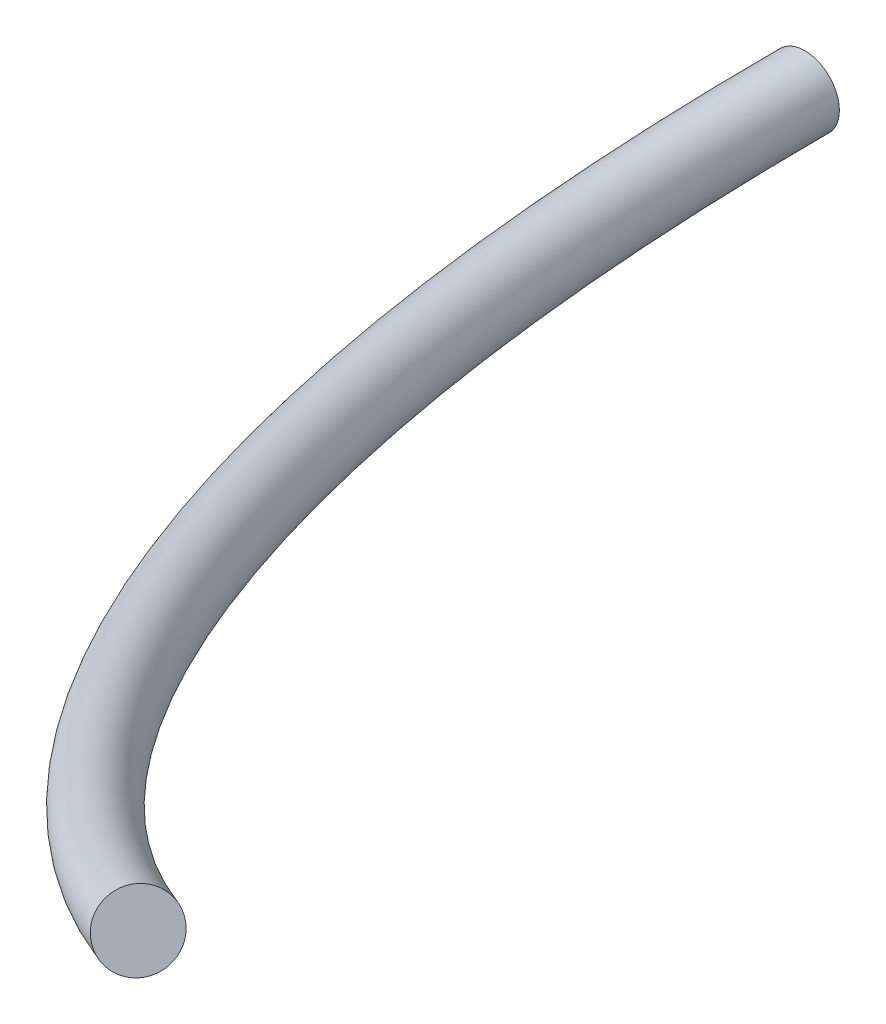
ISO-10303-21;
HEADER;
FILE_DESCRIPTION(('STEP AP214'),'2;1');
FILE_NAME('part.step','',(''),(''),'','','');
FILE_SCHEMA(('AUTOMOTIVE_DESIGN { 1 0 10303 214 1 1 1 1 }'));
ENDSEC;
DATA;
#1=APPLICATION_CONTEXT('core data for automotive mechanical design processes');
#2=APPLICATION_PROTOCOL_DEFINITION('international standard','automotive_design',2000,#1);
#3=PRODUCT_CONTEXT('',#1,'mechanical');
#4=PRODUCT('Part','Part','',(#3));
#5=PRODUCT_RELATED_PRODUCT_CATEGORY('part','',(#4));
#6=PRODUCT_DEFINITION_FORMATION('','',#4);
#7=PRODUCT_DEFINITION_CONTEXT('part definition',#1,'design');
#8=PRODUCT_DEFINITION('design','',#6,#7);
#9=PRODUCT_DEFINITION_SHAPE('','',#8);
#10=(LENGTH_UNIT() NAMED_UNIT(*) SI_UNIT(.MILLI.,.METRE.));
#11=(NAMED_UNIT(*) PLANE_ANGLE_UNIT() SI_UNIT($,.RADIAN.));
#12=(NAMED_UNIT(*) SI_UNIT($,.STERADIAN.) SOLID_ANGLE_UNIT());
#13=UNCERTAINTY_MEASURE_WITH_UNIT(LENGTH_MEASURE(1.E-05),#10,'distance_accuracy_value','');
#14=(GEOMETRIC_REPRESENTATION_CONTEXT(3) GLOBAL_UNCERTAINTY_ASSIGNED_CONTEXT((#13)) GLOBAL_UNIT_ASSIGNED_CONTEXT((#10,
#11,#12)) REPRESENTATION_CONTEXT('',''));
#15=CARTESIAN_POINT('',(0.,0.,0.));
#16=DIRECTION('',(0.,0.,1.));
#17=DIRECTION('',(1.,0.,0.));
#18=AXIS2_PLACEMENT_3D('',#15,#16,#17);
#19=CARTESIAN_POINT('',(-679.340465534291,-16590.9720062041,4.44089209850063E-12));
#20=DIRECTION('',(0.407551584204151,-0.913182186758309,0.));
#21=DIRECTION('',(0.913182186758309,0.407551584204151,0.));
#22=AXIS2_PLACEMENT_3D('',#19,#20,#21);
#23=TOROIDAL_SURFACE('',#22,2368.64476684583,50.7999999999926);
#24=CARTESIAN_POINT('',(-1793.91657334844,-17088.4053388322,2029.96507629727));
#25=DIRECTION('',(0.782611210158215,0.349277989804157,0.515290771868721));
#26=DIRECTION('',(0.595800147644292,-0.180393674505891,-0.782611210158213));
#27=AXIS2_PLACEMENT_3D('',#24,#25,#26);
#28=CIRCLE('',#27,50.7999999999926);
#29=CARTESIAN_POINT('',(-1817.82073452511,-17099.0737234085,2073.50145934605));
#30=VERTEX_POINT('',#29);
#31=EDGE_CURVE('E10',#30,#30,#28,.T.);
#32=CARTESIAN_POINT('',(-2842.34467337619,-17556.316933349,1.77635683940025E-12));
#33=DIRECTION('',(0.,0.,1.));
#34=DIRECTION('',(1.,0.,0.));
#35=AXIS2_PLACEMENT_3D('',#32,#33,#34);
#36=CIRCLE('',#35,50.7999999999926);
#37=CARTESIAN_POINT('',(-2888.73432846351,-17577.0205538266,1.71921091652616E-12));
#38=VERTEX_POINT('',#37);
#39=EDGE_CURVE('E41',#38,#38,#36,.T.);
#40=CARTESIAN_POINT('',(-679.340465534291,-16590.9720062041,4.44089209850063E-12));
#41=DIRECTION('',(0.407551584204151,-0.913182186758309,0.));
#42=DIRECTION('',(0.913182186758309,0.407551584204151,0.));
#43=AXIS2_PLACEMENT_3D('',#40,#41,#42);
#44=CIRCLE('',#43,2419.44476684582);
#45=EDGE_CURVE('',#30,#38,#44,.T.);
#46=ORIENTED_EDGE('',*,*,#31,.F.);
#47=ORIENTED_EDGE('',*,*,#39,.T.);
#48=ORIENTED_EDGE('',*,*,#45,.T.);
#49=ORIENTED_EDGE('',*,*,#45,.F.);
#50=EDGE_LOOP('',(#46,#48,#47,#49));
#51=FACE_BOUND('',#50,.T.);
#52=ADVANCED_FACE('F35',(#51),#23,.T.);
#53=CARTESIAN_POINT('',(-1793.91657334844,-17088.4053388322,2029.96507629727));
#54=DIRECTION('',(0.782611210158215,0.349277989804157,0.515290771868721));
#55=DIRECTION('',(0.595800147644292,-0.180393674505891,-0.782611210158213));
#56=AXIS2_PLACEMENT_3D('',#53,#54,#55);
#57=PLANE('',#56);
#58=ORIENTED_EDGE('',*,*,#31,.T.);
#59=EDGE_LOOP('',(#58));
#60=FACE_BOUND('',#59,.T.);
#61=ADVANCED_FACE('F50',(#60),#57,.T.);
#62=CARTESIAN_POINT('',(-2842.34467337619,-17556.316933349,1.77635683940025E-12));
#63=DIRECTION('',(0.,0.,1.));
#64=DIRECTION('',(1.,0.,0.));
#65=AXIS2_PLACEMENT_3D('',#62,#63,#64);
#66=PLANE('',#65);
#67=ORIENTED_EDGE('',*,*,#39,.F.);
#68=EDGE_LOOP('',(#67));
#69=FACE_BOUND('',#68,.T.);
#70=ADVANCED_FACE('F48',(#69),#66,.F.);
#71=CLOSED_SHELL('',(#52,#61,#70));
#72=MANIFOLD_SOLID_BREP('B2',#71);
#73=ADVANCED_BREP_SHAPE_REPRESENTATION('',(#18,#72),#14);
#74=SHAPE_DEFINITION_REPRESENTATION(#9,#73);
ENDSEC;
END-ISO-10303-21;
